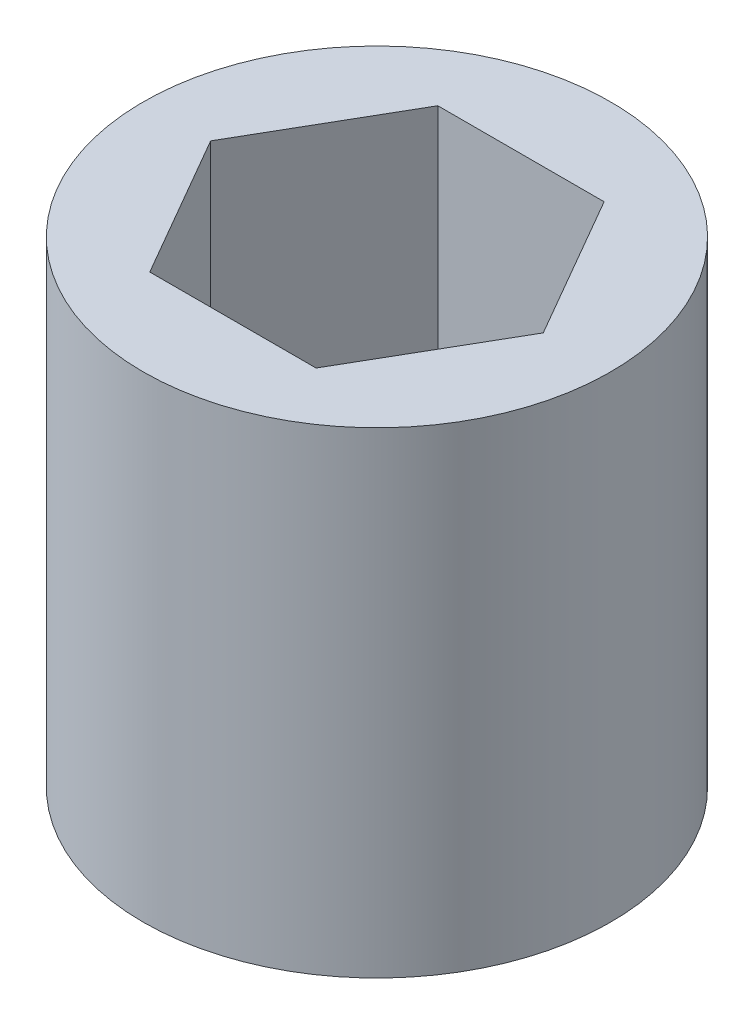
ISO-10303-21;
HEADER;
FILE_DESCRIPTION(('STEP AP214'),'2;1');
FILE_NAME('part.step','',(''),(''),'','','');
FILE_SCHEMA(('AUTOMOTIVE_DESIGN { 1 0 10303 214 1 1 1 1 }'));
ENDSEC;
DATA;
#1=APPLICATION_CONTEXT('core data for automotive mechanical design processes');
#2=APPLICATION_PROTOCOL_DEFINITION('international standard','automotive_design',2000,#1);
#3=PRODUCT_CONTEXT('',#1,'mechanical');
#4=PRODUCT('Part','Part','',(#3));
#5=PRODUCT_RELATED_PRODUCT_CATEGORY('part','',(#4));
#6=PRODUCT_DEFINITION_FORMATION('','',#4);
#7=PRODUCT_DEFINITION_CONTEXT('part definition',#1,'design');
#8=PRODUCT_DEFINITION('design','',#6,#7);
#9=PRODUCT_DEFINITION_SHAPE('','',#8);
#10=(LENGTH_UNIT() NAMED_UNIT(*) SI_UNIT(.MILLI.,.METRE.));
#11=(NAMED_UNIT(*) PLANE_ANGLE_UNIT() SI_UNIT($,.RADIAN.));
#12=(NAMED_UNIT(*) SI_UNIT($,.STERADIAN.) SOLID_ANGLE_UNIT());
#13=UNCERTAINTY_MEASURE_WITH_UNIT(LENGTH_MEASURE(1.E-05),#10,'distance_accuracy_value','');
#14=(GEOMETRIC_REPRESENTATION_CONTEXT(3) GLOBAL_UNCERTAINTY_ASSIGNED_CONTEXT((#13)) GLOBAL_UNIT_ASSIGNED_CONTEXT((#10,
#11,#12)) REPRESENTATION_CONTEXT('',''));
#15=CARTESIAN_POINT('',(0.,0.,0.));
#16=DIRECTION('',(0.,0.,1.));
#17=DIRECTION('',(1.,0.,0.));
#18=AXIS2_PLACEMENT_3D('',#15,#16,#17);
#19=CARTESIAN_POINT('',(0.,16.1798,0.));
#20=DIRECTION('',(0.,1.,0.));
#21=DIRECTION('',(0.,0.,1.));
#22=AXIS2_PLACEMENT_3D('',#19,#20,#21);
#23=PLANE('',#22);
#24=CARTESIAN_POINT('',(0.,16.1798,0.));
#25=DIRECTION('',(0.,1.,0.));
#26=DIRECTION('',(0.,0.,1.));
#27=AXIS2_PLACEMENT_3D('',#24,#25,#26);
#28=CIRCLE('',#27,7.9375);
#29=CARTESIAN_POINT('',(0.,16.1798,7.9375));
#30=VERTEX_POINT('',#29);
#31=EDGE_CURVE('E11',#30,#30,#28,.T.);
#32=ORIENTED_EDGE('',*,*,#31,.T.);
#33=EDGE_LOOP('',(#32));
#34=FACE_BOUND('',#33,.T.);
#35=DIRECTION('',(-0.5,0.,-0.866025403784439));
#36=VECTOR('',#35,1.);
#37=CARTESIAN_POINT('',(5.64590828240535,16.1798,0.));
#38=LINE('',#37,#36);
#39=CARTESIAN_POINT('',(5.64590828240535,16.1798,0.));
#40=VERTEX_POINT('',#39);
#41=CARTESIAN_POINT('',(2.82295414120267,16.1798,-4.8895));
#42=VERTEX_POINT('',#41);
#43=EDGE_CURVE('E98',#40,#42,#38,.T.);
#44=ORIENTED_EDGE('',*,*,#43,.F.);
#45=DIRECTION('',(0.5,0.,-0.866025403784439));
#46=VECTOR('',#45,1.);
#47=CARTESIAN_POINT('',(2.82295414120267,16.1798,4.8895));
#48=LINE('',#47,#46);
#49=CARTESIAN_POINT('',(2.82295414120267,16.1798,4.8895));
#50=VERTEX_POINT('',#49);
#51=EDGE_CURVE('E90',#50,#40,#48,.T.);
#52=ORIENTED_EDGE('',*,*,#51,.F.);
#53=DIRECTION('',(1.,0.,0.));
#54=VECTOR('',#53,1.);
#55=CARTESIAN_POINT('',(-2.82295414120267,16.1798,4.8895));
#56=LINE('',#55,#54);
#57=CARTESIAN_POINT('',(-2.82295414120267,16.1798,4.8895));
#58=VERTEX_POINT('',#57);
#59=EDGE_CURVE('E118',#58,#50,#56,.T.);
#60=ORIENTED_EDGE('',*,*,#59,.F.);
#61=DIRECTION('',(0.5,0.,0.866025403784438));
#62=VECTOR('',#61,1.);
#63=CARTESIAN_POINT('',(-5.64590828240535,16.1798,0.));
#64=LINE('',#63,#62);
#65=CARTESIAN_POINT('',(-5.64590828240535,16.1798,0.));
#66=VERTEX_POINT('',#65);
#67=EDGE_CURVE('E116',#66,#58,#64,.T.);
#68=ORIENTED_EDGE('',*,*,#67,.F.);
#69=DIRECTION('',(-0.5,0.,0.866025403784439));
#70=VECTOR('',#69,1.);
#71=CARTESIAN_POINT('',(-2.82295414120267,16.1798,-4.8895));
#72=LINE('',#71,#70);
#73=CARTESIAN_POINT('',(-2.82295414120267,16.1798,-4.8895));
#74=VERTEX_POINT('',#73);
#75=EDGE_CURVE('E112',#74,#66,#72,.T.);
#76=ORIENTED_EDGE('',*,*,#75,.F.);
#77=DIRECTION('',(-1.,0.,0.));
#78=VECTOR('',#77,1.);
#79=CARTESIAN_POINT('',(2.82295414120267,16.1798,-4.8895));
#80=LINE('',#79,#78);
#81=EDGE_CURVE('E110',#42,#74,#80,.T.);
#82=ORIENTED_EDGE('',*,*,#81,.F.);
#83=EDGE_LOOP('',(#44,#52,#60,#68,#76,#82));
#84=FACE_BOUND('',#83,.T.);
#85=ADVANCED_FACE('F37',(#34,#84),#23,.T.);
#86=CARTESIAN_POINT('',(0.,0.,0.));
#87=DIRECTION('',(0.,1.,0.));
#88=DIRECTION('',(0.,0.,1.));
#89=AXIS2_PLACEMENT_3D('',#86,#87,#88);
#90=PLANE('',#89);
#91=CARTESIAN_POINT('',(0.,0.,0.));
#92=DIRECTION('',(0.,1.,0.));
#93=DIRECTION('',(0.,0.,1.));
#94=AXIS2_PLACEMENT_3D('',#91,#92,#93);
#95=CIRCLE('',#94,7.9375);
#96=CARTESIAN_POINT('',(0.,0.,7.9375));
#97=VERTEX_POINT('',#96);
#98=EDGE_CURVE('E41',#97,#97,#95,.T.);
#99=ORIENTED_EDGE('',*,*,#98,.F.);
#100=EDGE_LOOP('',(#99));
#101=FACE_BOUND('',#100,.T.);
#102=DIRECTION('',(0.5,0.,-0.866025403784439));
#103=VECTOR('',#102,1.);
#104=CARTESIAN_POINT('',(2.82295414120267,0.,4.8895));
#105=LINE('',#104,#103);
#106=CARTESIAN_POINT('',(2.82295414120267,0.,4.8895));
#107=VERTEX_POINT('',#106);
#108=CARTESIAN_POINT('',(5.64590828240535,0.,0.));
#109=VERTEX_POINT('',#108);
#110=EDGE_CURVE('E60',#107,#109,#105,.T.);
#111=ORIENTED_EDGE('',*,*,#110,.T.);
#112=DIRECTION('',(-0.5,0.,-0.866025403784439));
#113=VECTOR('',#112,1.);
#114=CARTESIAN_POINT('',(5.64590828240535,0.,0.));
#115=LINE('',#114,#113);
#116=CARTESIAN_POINT('',(2.82295414120267,0.,-4.8895));
#117=VERTEX_POINT('',#116);
#118=EDGE_CURVE('E105',#109,#117,#115,.T.);
#119=ORIENTED_EDGE('',*,*,#118,.T.);
#120=DIRECTION('',(-1.,0.,0.));
#121=VECTOR('',#120,1.);
#122=CARTESIAN_POINT('',(2.82295414120267,0.,-4.8895));
#123=LINE('',#122,#121);
#124=CARTESIAN_POINT('',(-2.82295414120267,0.,-4.8895));
#125=VERTEX_POINT('',#124);
#126=EDGE_CURVE('E122',#117,#125,#123,.T.);
#127=ORIENTED_EDGE('',*,*,#126,.T.);
#128=DIRECTION('',(-0.5,0.,0.866025403784439));
#129=VECTOR('',#128,1.);
#130=CARTESIAN_POINT('',(-2.82295414120267,0.,-4.8895));
#131=LINE('',#130,#129);
#132=CARTESIAN_POINT('',(-5.64590828240535,0.,0.));
#133=VERTEX_POINT('',#132);
#134=EDGE_CURVE('E125',#125,#133,#131,.T.);
#135=ORIENTED_EDGE('',*,*,#134,.T.);
#136=DIRECTION('',(0.5,0.,0.866025403784438));
#137=VECTOR('',#136,1.);
#138=CARTESIAN_POINT('',(-5.64590828240535,0.,0.));
#139=LINE('',#138,#137);
#140=CARTESIAN_POINT('',(-2.82295414120267,0.,4.8895));
#141=VERTEX_POINT('',#140);
#142=EDGE_CURVE('E128',#133,#141,#139,.T.);
#143=ORIENTED_EDGE('',*,*,#142,.T.);
#144=DIRECTION('',(1.,0.,0.));
#145=VECTOR('',#144,1.);
#146=CARTESIAN_POINT('',(-2.82295414120267,0.,4.8895));
#147=LINE('',#146,#145);
#148=EDGE_CURVE('E99',#141,#107,#147,.T.);
#149=ORIENTED_EDGE('',*,*,#148,.T.);
#150=EDGE_LOOP('',(#111,#119,#127,#135,#143,#149));
#151=FACE_BOUND('',#150,.T.);
#152=ADVANCED_FACE('F145',(#101,#151),#90,.F.);
#153=CARTESIAN_POINT('',(0.,16.1798,0.));
#154=DIRECTION('',(0.,-1.,0.));
#155=DIRECTION('',(0.,0.,-1.));
#156=AXIS2_PLACEMENT_3D('',#153,#154,#155);
#157=CYLINDRICAL_SURFACE('',#156,7.9375);
#158=ORIENTED_EDGE('',*,*,#31,.F.);
#159=EDGE_LOOP('',(#158));
#160=FACE_BOUND('',#159,.T.);
#161=ORIENTED_EDGE('',*,*,#98,.T.);
#162=EDGE_LOOP('',(#161));
#163=FACE_BOUND('',#162,.T.);
#164=ADVANCED_FACE('F39',(#160,#163),#157,.T.);
#165=CARTESIAN_POINT('',(2.82295414120267,16.1798,4.8895));
#166=DIRECTION('',(-0.866025403784439,0.,-0.5));
#167=DIRECTION('',(-0.5,0.,0.866025403784439));
#168=AXIS2_PLACEMENT_3D('',#165,#166,#167);
#169=PLANE('',#168);
#170=ORIENTED_EDGE('',*,*,#110,.F.);
#171=DIRECTION('',(0.,-1.,0.));
#172=VECTOR('',#171,1.);
#173=CARTESIAN_POINT('',(2.82295414120267,16.1798,4.8895));
#174=LINE('',#173,#172);
#175=EDGE_CURVE('E94',#50,#107,#174,.T.);
#176=ORIENTED_EDGE('',*,*,#175,.F.);
#177=ORIENTED_EDGE('',*,*,#51,.T.);
#178=DIRECTION('',(0.,-1.,0.));
#179=VECTOR('',#178,1.);
#180=CARTESIAN_POINT('',(5.64590828240535,16.1798,0.));
#181=LINE('',#180,#179);
#182=EDGE_CURVE('E93',#40,#109,#181,.T.);
#183=ORIENTED_EDGE('',*,*,#182,.T.);
#184=EDGE_LOOP('',(#170,#176,#177,#183));
#185=FACE_BOUND('',#184,.T.);
#186=ADVANCED_FACE('F92',(#185),#169,.T.);
#187=CARTESIAN_POINT('',(5.64590828240535,16.1798,0.));
#188=DIRECTION('',(-0.866025403784438,0.,0.5));
#189=DIRECTION('',(0.5,0.,0.866025403784439));
#190=AXIS2_PLACEMENT_3D('',#187,#188,#189);
#191=PLANE('',#190);
#192=ORIENTED_EDGE('',*,*,#118,.F.);
#193=ORIENTED_EDGE('',*,*,#182,.F.);
#194=ORIENTED_EDGE('',*,*,#43,.T.);
#195=DIRECTION('',(0.,-1.,0.));
#196=VECTOR('',#195,1.);
#197=CARTESIAN_POINT('',(2.82295414120267,16.1798,-4.8895));
#198=LINE('',#197,#196);
#199=EDGE_CURVE('E106',#42,#117,#198,.T.);
#200=ORIENTED_EDGE('',*,*,#199,.T.);
#201=EDGE_LOOP('',(#192,#193,#194,#200));
#202=FACE_BOUND('',#201,.T.);
#203=ADVANCED_FACE('F102',(#202),#191,.T.);
#204=CARTESIAN_POINT('',(2.82295414120267,16.1798,-4.8895));
#205=DIRECTION('',(0.,0.,1.));
#206=DIRECTION('',(1.,0.,0.));
#207=AXIS2_PLACEMENT_3D('',#204,#205,#206);
#208=PLANE('',#207);
#209=ORIENTED_EDGE('',*,*,#126,.F.);
#210=ORIENTED_EDGE('',*,*,#199,.F.);
#211=ORIENTED_EDGE('',*,*,#81,.T.);
#212=DIRECTION('',(0.,-1.,0.));
#213=VECTOR('',#212,1.);
#214=CARTESIAN_POINT('',(-2.82295414120267,16.1798,-4.8895));
#215=LINE('',#214,#213);
#216=EDGE_CURVE('E137',#74,#125,#215,.T.);
#217=ORIENTED_EDGE('',*,*,#216,.T.);
#218=EDGE_LOOP('',(#209,#210,#211,#217));
#219=FACE_BOUND('',#218,.T.);
#220=ADVANCED_FACE('F141',(#219),#208,.T.);
#221=CARTESIAN_POINT('',(-2.82295414120267,16.1798,-4.8895));
#222=DIRECTION('',(0.866025403784439,0.,0.5));
#223=DIRECTION('',(0.5,0.,-0.866025403784439));
#224=AXIS2_PLACEMENT_3D('',#221,#222,#223);
#225=PLANE('',#224);
#226=ORIENTED_EDGE('',*,*,#134,.F.);
#227=ORIENTED_EDGE('',*,*,#216,.F.);
#228=ORIENTED_EDGE('',*,*,#75,.T.);
#229=DIRECTION('',(0.,-1.,0.));
#230=VECTOR('',#229,1.);
#231=CARTESIAN_POINT('',(-5.64590828240535,16.1798,0.));
#232=LINE('',#231,#230);
#233=EDGE_CURVE('E135',#66,#133,#232,.T.);
#234=ORIENTED_EDGE('',*,*,#233,.T.);
#235=EDGE_LOOP('',(#226,#227,#228,#234));
#236=FACE_BOUND('',#235,.T.);
#237=ADVANCED_FACE('F153',(#236),#225,.T.);
#238=CARTESIAN_POINT('',(-5.64590828240535,16.1798,0.));
#239=DIRECTION('',(0.866025403784438,0.,-0.5));
#240=DIRECTION('',(-0.5,0.,-0.866025403784439));
#241=AXIS2_PLACEMENT_3D('',#238,#239,#240);
#242=PLANE('',#241);
#243=ORIENTED_EDGE('',*,*,#142,.F.);
#244=ORIENTED_EDGE('',*,*,#233,.F.);
#245=ORIENTED_EDGE('',*,*,#67,.T.);
#246=DIRECTION('',(0.,-1.,0.));
#247=VECTOR('',#246,1.);
#248=CARTESIAN_POINT('',(-2.82295414120267,16.1798,4.8895));
#249=LINE('',#248,#247);
#250=EDGE_CURVE('E52',#58,#141,#249,.T.);
#251=ORIENTED_EDGE('',*,*,#250,.T.);
#252=EDGE_LOOP('',(#243,#244,#245,#251));
#253=FACE_BOUND('',#252,.T.);
#254=ADVANCED_FACE('F151',(#253),#242,.T.);
#255=CARTESIAN_POINT('',(-2.82295414120267,16.1798,4.8895));
#256=DIRECTION('',(0.,0.,-1.));
#257=DIRECTION('',(-1.,0.,0.));
#258=AXIS2_PLACEMENT_3D('',#255,#256,#257);
#259=PLANE('',#258);
#260=ORIENTED_EDGE('',*,*,#148,.F.);
#261=ORIENTED_EDGE('',*,*,#250,.F.);
#262=ORIENTED_EDGE('',*,*,#59,.T.);
#263=ORIENTED_EDGE('',*,*,#175,.T.);
#264=EDGE_LOOP('',(#260,#261,#262,#263));
#265=FACE_BOUND('',#264,.T.);
#266=ADVANCED_FACE('F147',(#265),#259,.T.);
#267=CLOSED_SHELL('',(#85,#152,#164,#186,#203,#220,#237,#254,#266));
#268=MANIFOLD_SOLID_BREP('B2',#267);
#269=ADVANCED_BREP_SHAPE_REPRESENTATION('',(#18,#268),#14);
#270=SHAPE_DEFINITION_REPRESENTATION(#9,#269);
ENDSEC;
END-ISO-10303-21;
